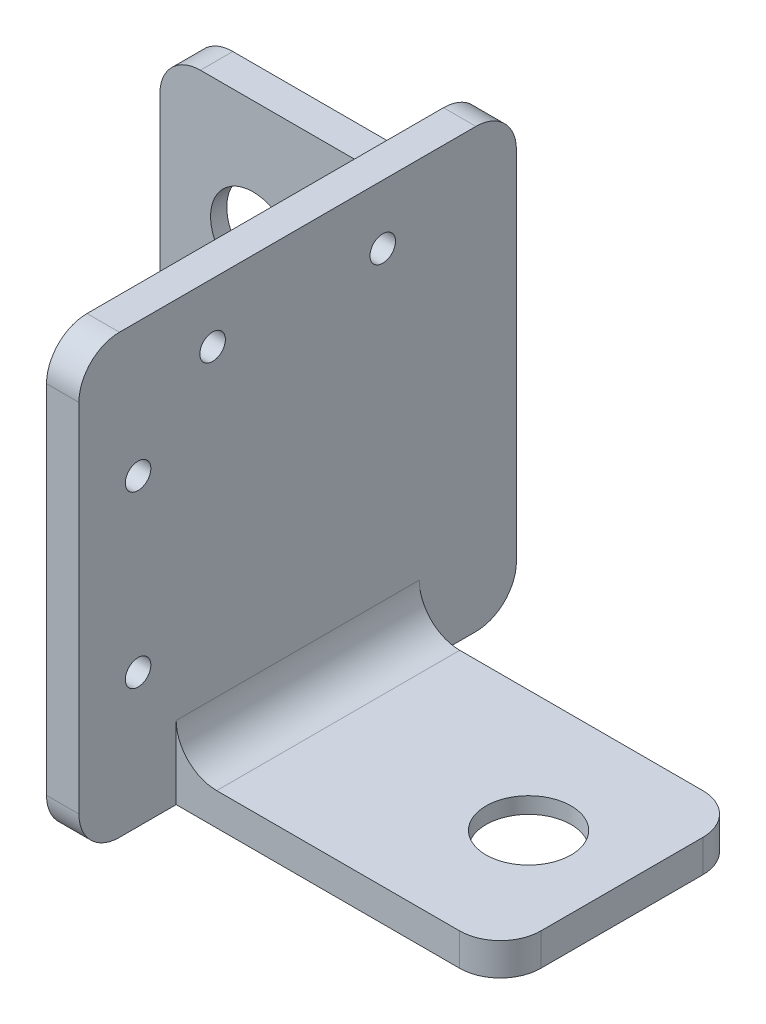
ISO-10303-21;
HEADER;
FILE_DESCRIPTION(('STEP AP214'),'2;1');
FILE_NAME('part.step','',(''),(''),'','','');
FILE_SCHEMA(('AUTOMOTIVE_DESIGN { 1 0 10303 214 1 1 1 1 }'));
ENDSEC;
DATA;
#1=APPLICATION_CONTEXT('core data for automotive mechanical design processes');
#2=APPLICATION_PROTOCOL_DEFINITION('international standard','automotive_design',2000,#1);
#3=PRODUCT_CONTEXT('',#1,'mechanical');
#4=PRODUCT('Part','Part','',(#3));
#5=PRODUCT_RELATED_PRODUCT_CATEGORY('part','',(#4));
#6=PRODUCT_DEFINITION_FORMATION('','',#4);
#7=PRODUCT_DEFINITION_CONTEXT('part definition',#1,'design');
#8=PRODUCT_DEFINITION('design','',#6,#7);
#9=PRODUCT_DEFINITION_SHAPE('','',#8);
#10=(LENGTH_UNIT() NAMED_UNIT(*) SI_UNIT(.MILLI.,.METRE.));
#11=(NAMED_UNIT(*) PLANE_ANGLE_UNIT() SI_UNIT($,.RADIAN.));
#12=(NAMED_UNIT(*) SI_UNIT($,.STERADIAN.) SOLID_ANGLE_UNIT());
#13=UNCERTAINTY_MEASURE_WITH_UNIT(LENGTH_MEASURE(1.E-05),#10,'distance_accuracy_value','');
#14=(GEOMETRIC_REPRESENTATION_CONTEXT(3) GLOBAL_UNCERTAINTY_ASSIGNED_CONTEXT((#13)) GLOBAL_UNIT_ASSIGNED_CONTEXT((#10,
#11,#12)) REPRESENTATION_CONTEXT('',''));
#15=CARTESIAN_POINT('',(0.,0.,0.));
#16=DIRECTION('',(0.,0.,1.));
#17=DIRECTION('',(1.,0.,0.));
#18=AXIS2_PLACEMENT_3D('',#15,#16,#17);
#19=CARTESIAN_POINT('',(0.,0.,0.));
#20=DIRECTION('',(-1.,0.,0.));
#21=DIRECTION('',(0.,0.,1.));
#22=AXIS2_PLACEMENT_3D('',#19,#20,#21);
#23=PLANE('',#22);
#24=CARTESIAN_POINT('',(0.,-10.5,19.7));
#25=DIRECTION('',(-1.,0.,0.));
#26=DIRECTION('',(0.,0.,1.));
#27=AXIS2_PLACEMENT_3D('',#24,#25,#26);
#28=CIRCLE('',#27,1.575);
#29=CARTESIAN_POINT('',(0.,-10.5,21.275));
#30=VERTEX_POINT('',#29);
#31=EDGE_CURVE('E460',#30,#30,#28,.T.);
#32=ORIENTED_EDGE('',*,*,#31,.F.);
#33=EDGE_LOOP('',(#32));
#34=FACE_BOUND('',#33,.T.);
#35=CARTESIAN_POINT('',(0.,10.5,19.7));
#36=DIRECTION('',(-1.,0.,0.));
#37=DIRECTION('',(0.,0.,1.));
#38=AXIS2_PLACEMENT_3D('',#35,#36,#37);
#39=CIRCLE('',#38,1.575);
#40=CARTESIAN_POINT('',(0.,10.5,21.275));
#41=VERTEX_POINT('',#40);
#42=EDGE_CURVE('E468',#41,#41,#39,.T.);
#43=ORIENTED_EDGE('',*,*,#42,.F.);
#44=EDGE_LOOP('',(#43));
#45=FACE_BOUND('',#44,.T.);
#46=CARTESIAN_POINT('',(0.,19.7,-10.5));
#47=DIRECTION('',(-1.,0.,0.));
#48=DIRECTION('',(0.,0.,1.));
#49=AXIS2_PLACEMENT_3D('',#46,#47,#48);
#50=CIRCLE('',#49,1.575);
#51=CARTESIAN_POINT('',(0.,19.7,-8.925));
#52=VERTEX_POINT('',#51);
#53=EDGE_CURVE('E293',#52,#52,#50,.T.);
#54=ORIENTED_EDGE('',*,*,#53,.F.);
#55=EDGE_LOOP('',(#54));
#56=FACE_BOUND('',#55,.T.);
#57=CARTESIAN_POINT('',(0.,19.7,10.5));
#58=DIRECTION('',(-1.,0.,0.));
#59=DIRECTION('',(0.,0.,1.));
#60=AXIS2_PLACEMENT_3D('',#57,#58,#59);
#61=CIRCLE('',#60,1.575);
#62=CARTESIAN_POINT('',(0.,19.7,12.075));
#63=VERTEX_POINT('',#62);
#64=EDGE_CURVE('E288',#63,#63,#61,.T.);
#65=ORIENTED_EDGE('',*,*,#64,.F.);
#66=EDGE_LOOP('',(#65));
#67=FACE_BOUND('',#66,.T.);
#68=DIRECTION('',(0.,1.,0.));
#69=VECTOR('',#68,1.);
#70=CARTESIAN_POINT('',(0.,15.003817371608,-23.));
#71=LINE('',#70,#69);
#72=CARTESIAN_POINT('',(0.,15.0036310727536,-23.));
#73=VERTEX_POINT('',#72);
#74=CARTESIAN_POINT('',(0.,15.003817371608,-23.));
#75=VERTEX_POINT('',#74);
#76=EDGE_CURVE('E484',#73,#75,#71,.T.);
#77=ORIENTED_EDGE('',*,*,#76,.F.);
#78=DIRECTION('',(0.,0.,1.));
#79=VECTOR('',#78,1.);
#80=CARTESIAN_POINT('',(0.,15.0036310727536,-23.));
#81=LINE('',#80,#79);
#82=CARTESIAN_POINT('',(0.,15.0036310727536,-17.0430910526527));
#83=VERTEX_POINT('',#82);
#84=EDGE_CURVE('E47',#73,#83,#81,.T.);
#85=ORIENTED_EDGE('',*,*,#84,.T.);
#86=DIRECTION('',(0.,-1.,0.));
#87=VECTOR('',#86,1.);
#88=CARTESIAN_POINT('',(0.,15.0036310727536,-17.0430910526527));
#89=LINE('',#88,#87);
#90=CARTESIAN_POINT('',(0.,-14.9963689272464,-17.0430910526526));
#91=VERTEX_POINT('',#90);
#92=EDGE_CURVE('E455',#83,#91,#89,.T.);
#93=ORIENTED_EDGE('',*,*,#92,.T.);
#94=DIRECTION('',(0.,0.,1.));
#95=VECTOR('',#94,1.);
#96=CARTESIAN_POINT('',(0.,-14.9963689272464,-27.));
#97=LINE('',#96,#95);
#98=CARTESIAN_POINT('',(0.,-14.9963689272464,-27.));
#99=VERTEX_POINT('',#98);
#100=EDGE_CURVE('E55',#99,#91,#97,.T.);
#101=ORIENTED_EDGE('',*,*,#100,.F.);
#102=DIRECTION('',(0.,1.,0.));
#103=VECTOR('',#102,1.);
#104=CARTESIAN_POINT('',(0.,-27.,-27.));
#105=LINE('',#104,#103);
#106=CARTESIAN_POINT('',(0.,-22.,-27.));
#107=VERTEX_POINT('',#106);
#108=EDGE_CURVE('E343',#107,#99,#105,.T.);
#109=ORIENTED_EDGE('',*,*,#108,.F.);
#110=CARTESIAN_POINT('',(0.,-22.,-22.));
#111=DIRECTION('',(-1.,0.,0.));
#112=DIRECTION('',(0.,0.,1.));
#113=AXIS2_PLACEMENT_3D('',#110,#111,#112);
#114=CIRCLE('',#113,5.);
#115=CARTESIAN_POINT('',(0.,-27.,-22.));
#116=VERTEX_POINT('',#115);
#117=EDGE_CURVE('E198',#107,#116,#114,.T.);
#118=ORIENTED_EDGE('',*,*,#117,.T.);
#119=DIRECTION('',(0.,0.,-1.));
#120=VECTOR('',#119,1.);
#121=CARTESIAN_POINT('',(0.,-27.,27.));
#122=LINE('',#121,#120);
#123=CARTESIAN_POINT('',(0.,-27.,22.));
#124=VERTEX_POINT('',#123);
#125=EDGE_CURVE('E206',#124,#116,#122,.T.);
#126=ORIENTED_EDGE('',*,*,#125,.F.);
#127=CARTESIAN_POINT('',(0.,-22.,22.));
#128=DIRECTION('',(-1.,0.,0.));
#129=DIRECTION('',(0.,0.,1.));
#130=AXIS2_PLACEMENT_3D('',#127,#128,#129);
#131=CIRCLE('',#130,5.);
#132=CARTESIAN_POINT('',(0.,-22.,27.));
#133=VERTEX_POINT('',#132);
#134=EDGE_CURVE('E188',#124,#133,#131,.T.);
#135=ORIENTED_EDGE('',*,*,#134,.T.);
#136=DIRECTION('',(0.,-1.,0.));
#137=VECTOR('',#136,1.);
#138=CARTESIAN_POINT('',(0.,-27.,27.));
#139=LINE('',#138,#137);
#140=CARTESIAN_POINT('',(0.,22.,27.));
#141=VERTEX_POINT('',#140);
#142=EDGE_CURVE('E215',#141,#133,#139,.T.);
#143=ORIENTED_EDGE('',*,*,#142,.F.);
#144=CARTESIAN_POINT('',(0.,22.,22.));
#145=DIRECTION('',(-1.,0.,0.));
#146=DIRECTION('',(0.,0.,1.));
#147=AXIS2_PLACEMENT_3D('',#144,#145,#146);
#148=CIRCLE('',#147,5.);
#149=CARTESIAN_POINT('',(0.,27.,22.));
#150=VERTEX_POINT('',#149);
#151=EDGE_CURVE('E210',#141,#150,#148,.T.);
#152=ORIENTED_EDGE('',*,*,#151,.T.);
#153=DIRECTION('',(0.,0.,1.));
#154=VECTOR('',#153,1.);
#155=CARTESIAN_POINT('',(0.,27.,27.));
#156=LINE('',#155,#154);
#157=CARTESIAN_POINT('',(0.,27.,-22.));
#158=VERTEX_POINT('',#157);
#159=EDGE_CURVE('E220',#158,#150,#156,.T.);
#160=ORIENTED_EDGE('',*,*,#159,.F.);
#161=CARTESIAN_POINT('',(0.,22.,-22.));
#162=DIRECTION('',(-1.,0.,0.));
#163=DIRECTION('',(0.,0.,1.));
#164=AXIS2_PLACEMENT_3D('',#161,#162,#163);
#165=CIRCLE('',#164,5.);
#166=CARTESIAN_POINT('',(0.,22.,-27.));
#167=VERTEX_POINT('',#166);
#168=EDGE_CURVE('E226',#158,#167,#165,.T.);
#169=ORIENTED_EDGE('',*,*,#168,.T.);
#170=CARTESIAN_POINT('',(0.,15.003817371608,-27.));
#171=VERTEX_POINT('',#170);
#172=EDGE_CURVE('E334',#171,#167,#105,.T.);
#173=ORIENTED_EDGE('',*,*,#172,.F.);
#174=DIRECTION('',(0.,0.,-1.));
#175=VECTOR('',#174,1.);
#176=CARTESIAN_POINT('',(0.,15.003817371608,-27.));
#177=LINE('',#176,#175);
#178=EDGE_CURVE('E486',#75,#171,#177,.T.);
#179=ORIENTED_EDGE('',*,*,#178,.F.);
#180=EDGE_LOOP('',(#77,#85,#93,#101,#109,#118,#126,#135,#143,#152,#160,#169,#173,#179));
#181=FACE_BOUND('',#180,.T.);
#182=ADVANCED_FACE('F32',(#34,#45,#56,#67,#181),#23,.T.);
#183=CARTESIAN_POINT('',(4.,0.,0.));
#184=DIRECTION('',(-1.,0.,0.));
#185=DIRECTION('',(0.,0.,1.));
#186=AXIS2_PLACEMENT_3D('',#183,#184,#185);
#187=PLANE('',#186);
#188=CARTESIAN_POINT('',(4.,-10.5,19.7));
#189=DIRECTION('',(-1.,0.,0.));
#190=DIRECTION('',(0.,0.,1.));
#191=AXIS2_PLACEMENT_3D('',#188,#189,#190);
#192=CIRCLE('',#191,1.575);
#193=CARTESIAN_POINT('',(4.,-10.5,21.275));
#194=VERTEX_POINT('',#193);
#195=EDGE_CURVE('E465',#194,#194,#192,.T.);
#196=ORIENTED_EDGE('',*,*,#195,.T.);
#197=EDGE_LOOP('',(#196));
#198=FACE_BOUND('',#197,.T.);
#199=CARTESIAN_POINT('',(4.,10.5,19.7));
#200=DIRECTION('',(-1.,0.,0.));
#201=DIRECTION('',(0.,0.,1.));
#202=AXIS2_PLACEMENT_3D('',#199,#200,#201);
#203=CIRCLE('',#202,1.575);
#204=CARTESIAN_POINT('',(4.,10.5,21.275));
#205=VERTEX_POINT('',#204);
#206=EDGE_CURVE('E471',#205,#205,#203,.T.);
#207=ORIENTED_EDGE('',*,*,#206,.T.);
#208=EDGE_LOOP('',(#207));
#209=FACE_BOUND('',#208,.T.);
#210=CARTESIAN_POINT('',(4.,19.7,-10.5));
#211=DIRECTION('',(1.,0.,0.));
#212=DIRECTION('',(0.,0.,-1.));
#213=AXIS2_PLACEMENT_3D('',#210,#211,#212);
#214=CIRCLE('',#213,1.575);
#215=CARTESIAN_POINT('',(4.,19.7,-12.075));
#216=VERTEX_POINT('',#215);
#217=EDGE_CURVE('E296',#216,#216,#214,.T.);
#218=ORIENTED_EDGE('',*,*,#217,.F.);
#219=EDGE_LOOP('',(#218));
#220=FACE_BOUND('',#219,.T.);
#221=CARTESIAN_POINT('',(4.,19.7,10.5));
#222=DIRECTION('',(1.,0.,0.));
#223=DIRECTION('',(0.,0.,-1.));
#224=AXIS2_PLACEMENT_3D('',#221,#222,#223);
#225=CIRCLE('',#224,1.575);
#226=CARTESIAN_POINT('',(4.,19.7,8.925));
#227=VERTEX_POINT('',#226);
#228=EDGE_CURVE('E292',#227,#227,#225,.T.);
#229=ORIENTED_EDGE('',*,*,#228,.F.);
#230=EDGE_LOOP('',(#229));
#231=FACE_BOUND('',#230,.T.);
#232=DIRECTION('',(0.,-1.,0.));
#233=VECTOR('',#232,1.);
#234=CARTESIAN_POINT('',(4.,-27.,14.9965263929302));
#235=LINE('',#234,#233);
#236=CARTESIAN_POINT('',(4.,-18.,14.9965263929302));
#237=VERTEX_POINT('',#236);
#238=CARTESIAN_POINT('',(4.,-27.,14.9965263929302));
#239=VERTEX_POINT('',#238);
#240=EDGE_CURVE('E308',#237,#239,#235,.T.);
#241=ORIENTED_EDGE('',*,*,#240,.F.);
#242=DIRECTION('',(0.,0.,1.));
#243=VECTOR('',#242,1.);
#244=CARTESIAN_POINT('',(4.,-18.,-15.0034736070698));
#245=LINE('',#244,#243);
#246=CARTESIAN_POINT('',(4.,-18.,-15.0034736070698));
#247=VERTEX_POINT('',#246);
#248=EDGE_CURVE('E299',#237,#247,#245,.F.);
#249=ORIENTED_EDGE('',*,*,#248,.T.);
#250=DIRECTION('',(0.,1.,0.));
#251=VECTOR('',#250,1.);
#252=CARTESIAN_POINT('',(4.,-27.,-15.0034736070698));
#253=LINE('',#252,#251);
#254=CARTESIAN_POINT('',(4.,-27.,-15.0034736070698));
#255=VERTEX_POINT('',#254);
#256=EDGE_CURVE('E317',#255,#247,#253,.T.);
#257=ORIENTED_EDGE('',*,*,#256,.F.);
#258=DIRECTION('',(0.,0.,-1.));
#259=VECTOR('',#258,1.);
#260=CARTESIAN_POINT('',(4.,-27.,27.));
#261=LINE('',#260,#259);
#262=CARTESIAN_POINT('',(4.,-27.,-22.));
#263=VERTEX_POINT('',#262);
#264=EDGE_CURVE('E341',#255,#263,#261,.T.);
#265=ORIENTED_EDGE('',*,*,#264,.T.);
#266=CARTESIAN_POINT('',(4.,-22.,-22.));
#267=DIRECTION('',(-1.,0.,0.));
#268=DIRECTION('',(0.,0.,1.));
#269=AXIS2_PLACEMENT_3D('',#266,#267,#268);
#270=CIRCLE('',#269,5.);
#271=CARTESIAN_POINT('',(4.,-22.,-27.));
#272=VERTEX_POINT('',#271);
#273=EDGE_CURVE('E237',#263,#272,#270,.F.);
#274=ORIENTED_EDGE('',*,*,#273,.T.);
#275=DIRECTION('',(0.,1.,0.));
#276=VECTOR('',#275,1.);
#277=CARTESIAN_POINT('',(4.,-27.,-27.));
#278=LINE('',#277,#276);
#279=CARTESIAN_POINT('',(4.,22.,-27.));
#280=VERTEX_POINT('',#279);
#281=EDGE_CURVE('E214',#272,#280,#278,.T.);
#282=ORIENTED_EDGE('',*,*,#281,.T.);
#283=CARTESIAN_POINT('',(4.,22.,-22.));
#284=DIRECTION('',(-1.,0.,0.));
#285=DIRECTION('',(0.,0.,1.));
#286=AXIS2_PLACEMENT_3D('',#283,#284,#285);
#287=CIRCLE('',#286,5.);
#288=CARTESIAN_POINT('',(4.,27.,-22.));
#289=VERTEX_POINT('',#288);
#290=EDGE_CURVE('E235',#280,#289,#287,.F.);
#291=ORIENTED_EDGE('',*,*,#290,.T.);
#292=DIRECTION('',(0.,0.,1.));
#293=VECTOR('',#292,1.);
#294=CARTESIAN_POINT('',(4.,27.,27.));
#295=LINE('',#294,#293);
#296=CARTESIAN_POINT('',(4.,27.,22.));
#297=VERTEX_POINT('',#296);
#298=EDGE_CURVE('E218',#289,#297,#295,.T.);
#299=ORIENTED_EDGE('',*,*,#298,.T.);
#300=CARTESIAN_POINT('',(4.,22.,22.));
#301=DIRECTION('',(-1.,0.,0.));
#302=DIRECTION('',(0.,0.,1.));
#303=AXIS2_PLACEMENT_3D('',#300,#301,#302);
#304=CIRCLE('',#303,5.);
#305=CARTESIAN_POINT('',(4.,22.,27.));
#306=VERTEX_POINT('',#305);
#307=EDGE_CURVE('E233',#297,#306,#304,.F.);
#308=ORIENTED_EDGE('',*,*,#307,.T.);
#309=DIRECTION('',(0.,-1.,0.));
#310=VECTOR('',#309,1.);
#311=CARTESIAN_POINT('',(4.,-27.,27.));
#312=LINE('',#311,#310);
#313=CARTESIAN_POINT('',(4.,-22.,27.));
#314=VERTEX_POINT('',#313);
#315=EDGE_CURVE('E338',#306,#314,#312,.T.);
#316=ORIENTED_EDGE('',*,*,#315,.T.);
#317=CARTESIAN_POINT('',(4.,-22.,22.));
#318=DIRECTION('',(-1.,0.,0.));
#319=DIRECTION('',(0.,0.,1.));
#320=AXIS2_PLACEMENT_3D('',#317,#318,#319);
#321=CIRCLE('',#320,5.);
#322=CARTESIAN_POINT('',(4.,-27.,22.));
#323=VERTEX_POINT('',#322);
#324=EDGE_CURVE('E239',#314,#323,#321,.F.);
#325=ORIENTED_EDGE('',*,*,#324,.T.);
#326=EDGE_CURVE('E209',#323,#239,#261,.T.);
#327=ORIENTED_EDGE('',*,*,#326,.T.);
#328=EDGE_LOOP('',(#241,#249,#257,#265,#274,#282,#291,#299,#308,#316,#325,#327));
#329=FACE_BOUND('',#328,.T.);
#330=ADVANCED_FACE('F316',(#198,#209,#220,#231,#329),#187,.F.);
#331=CARTESIAN_POINT('',(4.,-27.,-27.));
#332=DIRECTION('',(0.,0.,1.));
#333=DIRECTION('',(1.,0.,0.));
#334=AXIS2_PLACEMENT_3D('',#331,#332,#333);
#335=PLANE('',#334);
#336=CARTESIAN_POINT('',(-24.5,0.,-27.));
#337=DIRECTION('',(0.,0.,-1.));
#338=DIRECTION('',(-1.,0.,0.));
#339=AXIS2_PLACEMENT_3D('',#336,#337,#338);
#340=CIRCLE('',#339,11.);
#341=CARTESIAN_POINT('',(-35.5,0.,-27.));
#342=VERTEX_POINT('',#341);
#343=EDGE_CURVE('E601',#342,#342,#340,.T.);
#344=ORIENTED_EDGE('',*,*,#343,.F.);
#345=EDGE_LOOP('',(#344));
#346=FACE_BOUND('',#345,.T.);
#347=DIRECTION('',(0.,-1.,0.));
#348=VECTOR('',#347,1.);
#349=CARTESIAN_POINT('',(-36.,15.003817371608,-27.));
#350=LINE('',#349,#348);
#351=CARTESIAN_POINT('',(-36.,10.003817371608,-27.));
#352=VERTEX_POINT('',#351);
#353=CARTESIAN_POINT('',(-36.,-9.9963689272464,-27.));
#354=VERTEX_POINT('',#353);
#355=EDGE_CURVE('E291',#352,#354,#350,.T.);
#356=ORIENTED_EDGE('',*,*,#355,.F.);
#357=CARTESIAN_POINT('',(-31.,10.003817371608,-27.));
#358=DIRECTION('',(0.,0.,1.));
#359=DIRECTION('',(1.,0.,0.));
#360=AXIS2_PLACEMENT_3D('',#357,#358,#359);
#361=CIRCLE('',#360,5.);
#362=CARTESIAN_POINT('',(-31.,15.003817371608,-27.));
#363=VERTEX_POINT('',#362);
#364=EDGE_CURVE('E277',#352,#363,#361,.F.);
#365=ORIENTED_EDGE('',*,*,#364,.T.);
#366=DIRECTION('',(1.,0.,0.));
#367=VECTOR('',#366,1.);
#368=CARTESIAN_POINT('',(-3.,15.003817371608,-27.));
#369=LINE('',#368,#367);
#370=EDGE_CURVE('E489',#363,#171,#369,.T.);
#371=ORIENTED_EDGE('',*,*,#370,.T.);
#372=ORIENTED_EDGE('',*,*,#172,.T.);
#373=DIRECTION('',(-1.,0.,0.));
#374=VECTOR('',#373,1.);
#375=CARTESIAN_POINT('',(4.,22.,-27.));
#376=LINE('',#375,#374);
#377=EDGE_CURVE('E241',#167,#280,#376,.F.);
#378=ORIENTED_EDGE('',*,*,#377,.T.);
#379=ORIENTED_EDGE('',*,*,#281,.F.);
#380=DIRECTION('',(-1.,0.,0.));
#381=VECTOR('',#380,1.);
#382=CARTESIAN_POINT('',(4.,-22.,-27.));
#383=LINE('',#382,#381);
#384=EDGE_CURVE('E243',#272,#107,#383,.T.);
#385=ORIENTED_EDGE('',*,*,#384,.T.);
#386=ORIENTED_EDGE('',*,*,#108,.T.);
#387=DIRECTION('',(1.,0.,0.));
#388=VECTOR('',#387,1.);
#389=CARTESIAN_POINT('',(-3.,-14.9963689272464,-27.));
#390=LINE('',#389,#388);
#391=CARTESIAN_POINT('',(-31.,-14.9963689272464,-27.));
#392=VERTEX_POINT('',#391);
#393=EDGE_CURVE('E496',#392,#99,#390,.T.);
#394=ORIENTED_EDGE('',*,*,#393,.F.);
#395=CARTESIAN_POINT('',(-31.,-9.9963689272464,-27.));
#396=DIRECTION('',(0.,0.,1.));
#397=DIRECTION('',(1.,0.,0.));
#398=AXIS2_PLACEMENT_3D('',#395,#396,#397);
#399=CIRCLE('',#398,5.);
#400=EDGE_CURVE('E275',#392,#354,#399,.F.);
#401=ORIENTED_EDGE('',*,*,#400,.T.);
#402=EDGE_LOOP('',(#356,#365,#371,#372,#378,#379,#385,#386,#394,#401));
#403=FACE_BOUND('',#402,.T.);
#404=ADVANCED_FACE('F367',(#346,#403),#335,.F.);
#405=CARTESIAN_POINT('',(4.,27.,27.));
#406=DIRECTION('',(0.,-1.,0.));
#407=DIRECTION('',(0.,0.,-1.));
#408=AXIS2_PLACEMENT_3D('',#405,#406,#407);
#409=PLANE('',#408);
#410=ORIENTED_EDGE('',*,*,#298,.F.);
#411=DIRECTION('',(-1.,0.,0.));
#412=VECTOR('',#411,1.);
#413=CARTESIAN_POINT('',(4.,27.,-22.));
#414=LINE('',#413,#412);
#415=EDGE_CURVE('E248',#289,#158,#414,.T.);
#416=ORIENTED_EDGE('',*,*,#415,.T.);
#417=ORIENTED_EDGE('',*,*,#159,.T.);
#418=DIRECTION('',(-1.,0.,0.));
#419=VECTOR('',#418,1.);
#420=CARTESIAN_POINT('',(4.,27.,22.));
#421=LINE('',#420,#419);
#422=EDGE_CURVE('E246',#150,#297,#421,.F.);
#423=ORIENTED_EDGE('',*,*,#422,.T.);
#424=EDGE_LOOP('',(#410,#416,#417,#423));
#425=FACE_BOUND('',#424,.T.);
#426=ADVANCED_FACE('F350',(#425),#409,.F.);
#427=CARTESIAN_POINT('',(4.,-27.,27.));
#428=DIRECTION('',(0.,0.,-1.));
#429=DIRECTION('',(-1.,0.,0.));
#430=AXIS2_PLACEMENT_3D('',#427,#428,#429);
#431=PLANE('',#430);
#432=ORIENTED_EDGE('',*,*,#142,.T.);
#433=DIRECTION('',(-1.,0.,0.));
#434=VECTOR('',#433,1.);
#435=CARTESIAN_POINT('',(4.,-22.,27.));
#436=LINE('',#435,#434);
#437=EDGE_CURVE('E193',#133,#314,#436,.F.);
#438=ORIENTED_EDGE('',*,*,#437,.T.);
#439=ORIENTED_EDGE('',*,*,#315,.F.);
#440=DIRECTION('',(-1.,0.,0.));
#441=VECTOR('',#440,1.);
#442=CARTESIAN_POINT('',(4.,22.,27.));
#443=LINE('',#442,#441);
#444=EDGE_CURVE('E197',#306,#141,#443,.T.);
#445=ORIENTED_EDGE('',*,*,#444,.T.);
#446=EDGE_LOOP('',(#432,#438,#439,#445));
#447=FACE_BOUND('',#446,.T.);
#448=ADVANCED_FACE('F358',(#447),#431,.F.);
#449=CARTESIAN_POINT('',(4.,-27.,27.));
#450=DIRECTION('',(0.,1.,0.));
#451=DIRECTION('',(0.,0.,1.));
#452=AXIS2_PLACEMENT_3D('',#449,#450,#451);
#453=PLANE('',#452);
#454=CARTESIAN_POINT('',(32.5,-27.,0.));
#455=DIRECTION('',(0.,-1.,0.));
#456=DIRECTION('',(0.,0.,-1.));
#457=AXIS2_PLACEMENT_3D('',#454,#455,#456);
#458=CIRCLE('',#457,11.);
#459=CARTESIAN_POINT('',(32.5,-27.,-11.));
#460=VERTEX_POINT('',#459);
#461=EDGE_CURVE('E443',#460,#460,#458,.T.);
#462=ORIENTED_EDGE('',*,*,#461,.F.);
#463=EDGE_LOOP('',(#462));
#464=FACE_BOUND('',#463,.T.);
#465=DIRECTION('',(-1.,0.,0.));
#466=VECTOR('',#465,1.);
#467=CARTESIAN_POINT('',(7.,-27.,-15.0034736070698));
#468=LINE('',#467,#466);
#469=CARTESIAN_POINT('',(39.,-27.,-15.0034736070698));
#470=VERTEX_POINT('',#469);
#471=EDGE_CURVE('E331',#470,#255,#468,.T.);
#472=ORIENTED_EDGE('',*,*,#471,.F.);
#473=CARTESIAN_POINT('',(39.,-27.,-10.0034736070698));
#474=DIRECTION('',(0.,1.,0.));
#475=DIRECTION('',(0.,0.,1.));
#476=AXIS2_PLACEMENT_3D('',#473,#474,#475);
#477=CIRCLE('',#476,5.);
#478=CARTESIAN_POINT('',(44.,-27.,-10.0034736070698));
#479=VERTEX_POINT('',#478);
#480=EDGE_CURVE('E265',#470,#479,#477,.F.);
#481=ORIENTED_EDGE('',*,*,#480,.T.);
#482=DIRECTION('',(0.,0.,-1.));
#483=VECTOR('',#482,1.);
#484=CARTESIAN_POINT('',(44.,-27.,14.9965263929302));
#485=LINE('',#484,#483);
#486=CARTESIAN_POINT('',(44.,-27.,9.99652639293024));
#487=VERTEX_POINT('',#486);
#488=EDGE_CURVE('E323',#487,#479,#485,.T.);
#489=ORIENTED_EDGE('',*,*,#488,.F.);
#490=CARTESIAN_POINT('',(39.,-27.,9.99652639293024));
#491=DIRECTION('',(0.,1.,0.));
#492=DIRECTION('',(0.,0.,1.));
#493=AXIS2_PLACEMENT_3D('',#490,#491,#492);
#494=CIRCLE('',#493,5.);
#495=CARTESIAN_POINT('',(39.,-27.,14.9965263929302));
#496=VERTEX_POINT('',#495);
#497=EDGE_CURVE('E263',#487,#496,#494,.F.);
#498=ORIENTED_EDGE('',*,*,#497,.T.);
#499=DIRECTION('',(-1.,0.,0.));
#500=VECTOR('',#499,1.);
#501=CARTESIAN_POINT('',(7.,-27.,14.9965263929302));
#502=LINE('',#501,#500);
#503=EDGE_CURVE('E333',#496,#239,#502,.T.);
#504=ORIENTED_EDGE('',*,*,#503,.T.);
#505=ORIENTED_EDGE('',*,*,#326,.F.);
#506=DIRECTION('',(-1.,0.,0.));
#507=VECTOR('',#506,1.);
#508=CARTESIAN_POINT('',(4.,-27.,22.));
#509=LINE('',#508,#507);
#510=EDGE_CURVE('E192',#323,#124,#509,.T.);
#511=ORIENTED_EDGE('',*,*,#510,.T.);
#512=ORIENTED_EDGE('',*,*,#125,.T.);
#513=DIRECTION('',(-1.,0.,0.));
#514=VECTOR('',#513,1.);
#515=CARTESIAN_POINT('',(4.,-27.,-22.));
#516=LINE('',#515,#514);
#517=EDGE_CURVE('E211',#116,#263,#516,.F.);
#518=ORIENTED_EDGE('',*,*,#517,.T.);
#519=ORIENTED_EDGE('',*,*,#264,.F.);
#520=EDGE_LOOP('',(#472,#481,#489,#498,#504,#505,#511,#512,#518,#519));
#521=FACE_BOUND('',#520,.T.);
#522=ADVANCED_FACE('F204',(#464,#521),#453,.F.);
#523=CARTESIAN_POINT('',(4.,-22.,22.));
#524=DIRECTION('',(-1.,0.,0.));
#525=DIRECTION('',(0.,0.,1.));
#526=AXIS2_PLACEMENT_3D('',#523,#524,#525);
#527=CYLINDRICAL_SURFACE('',#526,5.);
#528=ORIENTED_EDGE('',*,*,#324,.F.);
#529=ORIENTED_EDGE('',*,*,#437,.F.);
#530=ORIENTED_EDGE('',*,*,#134,.F.);
#531=ORIENTED_EDGE('',*,*,#510,.F.);
#532=EDGE_LOOP('',(#528,#529,#530,#531));
#533=FACE_BOUND('',#532,.T.);
#534=ADVANCED_FACE('F191',(#533),#527,.T.);
#535=CARTESIAN_POINT('',(4.,-22.,-22.));
#536=DIRECTION('',(-1.,0.,0.));
#537=DIRECTION('',(0.,0.,1.));
#538=AXIS2_PLACEMENT_3D('',#535,#536,#537);
#539=CYLINDRICAL_SURFACE('',#538,5.);
#540=ORIENTED_EDGE('',*,*,#273,.F.);
#541=ORIENTED_EDGE('',*,*,#517,.F.);
#542=ORIENTED_EDGE('',*,*,#117,.F.);
#543=ORIENTED_EDGE('',*,*,#384,.F.);
#544=EDGE_LOOP('',(#540,#541,#542,#543));
#545=FACE_BOUND('',#544,.T.);
#546=ADVANCED_FACE('F515',(#545),#539,.T.);
#547=CARTESIAN_POINT('',(4.,22.,-22.));
#548=DIRECTION('',(-1.,0.,0.));
#549=DIRECTION('',(0.,0.,1.));
#550=AXIS2_PLACEMENT_3D('',#547,#548,#549);
#551=CYLINDRICAL_SURFACE('',#550,5.);
#552=ORIENTED_EDGE('',*,*,#290,.F.);
#553=ORIENTED_EDGE('',*,*,#377,.F.);
#554=ORIENTED_EDGE('',*,*,#168,.F.);
#555=ORIENTED_EDGE('',*,*,#415,.F.);
#556=EDGE_LOOP('',(#552,#553,#554,#555));
#557=FACE_BOUND('',#556,.T.);
#558=ADVANCED_FACE('F517',(#557),#551,.T.);
#559=CARTESIAN_POINT('',(4.,22.,22.));
#560=DIRECTION('',(-1.,0.,0.));
#561=DIRECTION('',(0.,0.,1.));
#562=AXIS2_PLACEMENT_3D('',#559,#560,#561);
#563=CYLINDRICAL_SURFACE('',#562,5.);
#564=ORIENTED_EDGE('',*,*,#307,.F.);
#565=ORIENTED_EDGE('',*,*,#422,.F.);
#566=ORIENTED_EDGE('',*,*,#151,.F.);
#567=ORIENTED_EDGE('',*,*,#444,.F.);
#568=EDGE_LOOP('',(#564,#565,#566,#567));
#569=FACE_BOUND('',#568,.T.);
#570=ADVANCED_FACE('F354',(#569),#563,.T.);
#571=CARTESIAN_POINT('',(7.,-27.,14.9965263929302));
#572=DIRECTION('',(0.,0.,-1.));
#573=DIRECTION('',(-1.,0.,0.));
#574=AXIS2_PLACEMENT_3D('',#571,#572,#573);
#575=PLANE('',#574);
#576=ORIENTED_EDGE('',*,*,#503,.F.);
#577=DIRECTION('',(0.,-1.,0.));
#578=VECTOR('',#577,1.);
#579=CARTESIAN_POINT('',(39.,-27.,14.9965263929302));
#580=LINE('',#579,#578);
#581=CARTESIAN_POINT('',(39.,-23.,14.9965263929302));
#582=VERTEX_POINT('',#581);
#583=EDGE_CURVE('E267',#496,#582,#580,.F.);
#584=ORIENTED_EDGE('',*,*,#583,.T.);
#585=DIRECTION('',(-1.,0.,0.));
#586=VECTOR('',#585,1.);
#587=CARTESIAN_POINT('',(7.,-23.,14.9965263929302));
#588=LINE('',#587,#586);
#589=CARTESIAN_POINT('',(9.,-23.,14.9965263929302));
#590=VERTEX_POINT('',#589);
#591=EDGE_CURVE('E310',#582,#590,#588,.T.);
#592=ORIENTED_EDGE('',*,*,#591,.T.);
#593=CARTESIAN_POINT('',(9.,-18.,14.9965263929302));
#594=DIRECTION('',(0.,0.,-1.));
#595=DIRECTION('',(-1.,0.,0.));
#596=AXIS2_PLACEMENT_3D('',#593,#594,#595);
#597=CIRCLE('',#596,5.);
#598=EDGE_CURVE('E40',#590,#237,#597,.T.);
#599=ORIENTED_EDGE('',*,*,#598,.T.);
#600=ORIENTED_EDGE('',*,*,#240,.T.);
#601=EDGE_LOOP('',(#576,#584,#592,#599,#600));
#602=FACE_BOUND('',#601,.T.);
#603=ADVANCED_FACE('F307',(#602),#575,.F.);
#604=CARTESIAN_POINT('',(7.,-27.,-15.0034736070698));
#605=DIRECTION('',(0.,0.,1.));
#606=DIRECTION('',(1.,0.,0.));
#607=AXIS2_PLACEMENT_3D('',#604,#605,#606);
#608=PLANE('',#607);
#609=DIRECTION('',(-1.,0.,0.));
#610=VECTOR('',#609,1.);
#611=CARTESIAN_POINT('',(7.,-23.,-15.0034736070698));
#612=LINE('',#611,#610);
#613=CARTESIAN_POINT('',(39.,-23.,-15.0034736070698));
#614=VERTEX_POINT('',#613);
#615=CARTESIAN_POINT('',(9.,-23.,-15.0034736070698));
#616=VERTEX_POINT('',#615);
#617=EDGE_CURVE('E328',#614,#616,#612,.T.);
#618=ORIENTED_EDGE('',*,*,#617,.F.);
#619=DIRECTION('',(0.,1.,0.));
#620=VECTOR('',#619,1.);
#621=CARTESIAN_POINT('',(39.,-27.,-15.0034736070698));
#622=LINE('',#621,#620);
#623=EDGE_CURVE('E261',#614,#470,#622,.F.);
#624=ORIENTED_EDGE('',*,*,#623,.T.);
#625=ORIENTED_EDGE('',*,*,#471,.T.);
#626=ORIENTED_EDGE('',*,*,#256,.T.);
#627=CARTESIAN_POINT('',(9.,-18.,-15.0034736070698));
#628=DIRECTION('',(0.,0.,1.));
#629=DIRECTION('',(1.,0.,0.));
#630=AXIS2_PLACEMENT_3D('',#627,#628,#629);
#631=CIRCLE('',#630,5.);
#632=EDGE_CURVE('E11',#247,#616,#631,.T.);
#633=ORIENTED_EDGE('',*,*,#632,.T.);
#634=EDGE_LOOP('',(#618,#624,#625,#626,#633));
#635=FACE_BOUND('',#634,.T.);
#636=ADVANCED_FACE('F382',(#635),#608,.F.);
#637=CARTESIAN_POINT('',(7.,-23.,14.9965263929302));
#638=DIRECTION('',(0.,-1.,0.));
#639=DIRECTION('',(0.,0.,-1.));
#640=AXIS2_PLACEMENT_3D('',#637,#638,#639);
#641=PLANE('',#640);
#642=CARTESIAN_POINT('',(32.5,-23.,0.));
#643=DIRECTION('',(0.,1.,0.));
#644=DIRECTION('',(0.,0.,1.));
#645=AXIS2_PLACEMENT_3D('',#642,#643,#644);
#646=CIRCLE('',#645,5.25);
#647=CARTESIAN_POINT('',(32.5,-23.,5.25));
#648=VERTEX_POINT('',#647);
#649=EDGE_CURVE('E607',#648,#648,#646,.T.);
#650=ORIENTED_EDGE('',*,*,#649,.F.);
#651=EDGE_LOOP('',(#650));
#652=FACE_BOUND('',#651,.T.);
#653=ORIENTED_EDGE('',*,*,#617,.T.);
#654=DIRECTION('',(0.,0.,1.));
#655=VECTOR('',#654,1.);
#656=CARTESIAN_POINT('',(9.,-23.,14.9965263929302));
#657=LINE('',#656,#655);
#658=EDGE_CURVE('E287',#616,#590,#657,.T.);
#659=ORIENTED_EDGE('',*,*,#658,.T.);
#660=ORIENTED_EDGE('',*,*,#591,.F.);
#661=CARTESIAN_POINT('',(39.,-23.,9.99652639293024));
#662=DIRECTION('',(0.,-1.,0.));
#663=DIRECTION('',(0.,0.,-1.));
#664=AXIS2_PLACEMENT_3D('',#661,#662,#663);
#665=CIRCLE('',#664,5.);
#666=CARTESIAN_POINT('',(44.,-23.,9.99652639293024));
#667=VERTEX_POINT('',#666);
#668=EDGE_CURVE('E257',#582,#667,#665,.F.);
#669=ORIENTED_EDGE('',*,*,#668,.T.);
#670=DIRECTION('',(0.,0.,1.));
#671=VECTOR('',#670,1.);
#672=CARTESIAN_POINT('',(44.,-23.,14.9965263929302));
#673=LINE('',#672,#671);
#674=CARTESIAN_POINT('',(44.,-23.,-10.0034736070698));
#675=VERTEX_POINT('',#674);
#676=EDGE_CURVE('E319',#675,#667,#673,.T.);
#677=ORIENTED_EDGE('',*,*,#676,.F.);
#678=CARTESIAN_POINT('',(39.,-23.,-10.0034736070698));
#679=DIRECTION('',(0.,-1.,0.));
#680=DIRECTION('',(0.,0.,-1.));
#681=AXIS2_PLACEMENT_3D('',#678,#679,#680);
#682=CIRCLE('',#681,5.);
#683=EDGE_CURVE('E259',#675,#614,#682,.F.);
#684=ORIENTED_EDGE('',*,*,#683,.T.);
#685=EDGE_LOOP('',(#653,#659,#660,#669,#677,#684));
#686=FACE_BOUND('',#685,.T.);
#687=ADVANCED_FACE('F385',(#652,#686),#641,.F.);
#688=CARTESIAN_POINT('',(44.,0.,0.));
#689=DIRECTION('',(-1.,0.,0.));
#690=DIRECTION('',(0.,0.,1.));
#691=AXIS2_PLACEMENT_3D('',#688,#689,#690);
#692=PLANE('',#691);
#693=ORIENTED_EDGE('',*,*,#488,.T.);
#694=DIRECTION('',(0.,1.,0.));
#695=VECTOR('',#694,1.);
#696=CARTESIAN_POINT('',(44.,0.,-10.0034736070698));
#697=LINE('',#696,#695);
#698=EDGE_CURVE('E254',#479,#675,#697,.T.);
#699=ORIENTED_EDGE('',*,*,#698,.T.);
#700=ORIENTED_EDGE('',*,*,#676,.T.);
#701=DIRECTION('',(0.,-1.,0.));
#702=VECTOR('',#701,1.);
#703=CARTESIAN_POINT('',(44.,0.,9.99652639293024));
#704=LINE('',#703,#702);
#705=EDGE_CURVE('E251',#667,#487,#704,.T.);
#706=ORIENTED_EDGE('',*,*,#705,.T.);
#707=EDGE_LOOP('',(#693,#699,#700,#706));
#708=FACE_BOUND('',#707,.T.);
#709=ADVANCED_FACE('F389',(#708),#692,.F.);
#710=CARTESIAN_POINT('',(-3.,-14.9963689272464,-27.));
#711=DIRECTION('',(0.,1.,0.));
#712=DIRECTION('',(0.,0.,1.));
#713=AXIS2_PLACEMENT_3D('',#710,#711,#712);
#714=PLANE('',#713);
#715=DIRECTION('',(1.,0.,0.));
#716=VECTOR('',#715,1.);
#717=CARTESIAN_POINT('',(-3.,-14.9963689272464,-23.));
#718=LINE('',#717,#716);
#719=CARTESIAN_POINT('',(-31.,-14.9963689272464,-23.));
#720=VERTEX_POINT('',#719);
#721=CARTESIAN_POINT('',(-6.77177305791649,-14.9963689272464,-23.));
#722=VERTEX_POINT('',#721);
#723=EDGE_CURVE('E494',#720,#722,#718,.T.);
#724=ORIENTED_EDGE('',*,*,#723,.F.);
#725=DIRECTION('',(0.,0.,1.));
#726=VECTOR('',#725,1.);
#727=CARTESIAN_POINT('',(-31.,-14.9963689272464,-27.));
#728=LINE('',#727,#726);
#729=EDGE_CURVE('E285',#720,#392,#728,.F.);
#730=ORIENTED_EDGE('',*,*,#729,.T.);
#731=ORIENTED_EDGE('',*,*,#393,.T.);
#732=ORIENTED_EDGE('',*,*,#100,.T.);
#733=CARTESIAN_POINT('',(0.,-14.9963689272464,-17.0430910526526));
#734=CARTESIAN_POINT('',(-0.522042102032023,-14.9963689272464,-20.0037389349819));
#735=CARTESIAN_POINT('',(-3.43234437863522,-14.9963689272464,-22.4111686236911));
#736=CARTESIAN_POINT('',(-6.77177305791649,-14.9963689272464,-23.));
#737=B_SPLINE_CURVE_WITH_KNOTS('',3,(#733,#734,#735,#736),.UNSPECIFIED.,.F.,.F.,(4,4),(0.,1.),.UNSPECIFIED.);
#738=EDGE_CURVE('E442',#91,#722,#737,.T.);
#739=ORIENTED_EDGE('',*,*,#738,.T.);
#740=EDGE_LOOP('',(#724,#730,#731,#732,#739));
#741=FACE_BOUND('',#740,.T.);
#742=ADVANCED_FACE('F393',(#741),#714,.F.);
#743=CARTESIAN_POINT('',(-3.,15.003817371608,-23.));
#744=DIRECTION('',(0.,0.,-1.));
#745=DIRECTION('',(0.,1.,0.));
#746=AXIS2_PLACEMENT_3D('',#743,#744,#745);
#747=PLANE('',#746);
#748=CARTESIAN_POINT('',(-24.5,0.,-23.));
#749=DIRECTION('',(0.,0.,1.));
#750=DIRECTION('',(1.,0.,0.));
#751=AXIS2_PLACEMENT_3D('',#748,#749,#750);
#752=CIRCLE('',#751,5.25);
#753=CARTESIAN_POINT('',(-19.25,0.,-23.));
#754=VERTEX_POINT('',#753);
#755=EDGE_CURVE('E599',#754,#754,#752,.T.);
#756=ORIENTED_EDGE('',*,*,#755,.F.);
#757=EDGE_LOOP('',(#756));
#758=FACE_BOUND('',#757,.T.);
#759=ORIENTED_EDGE('',*,*,#723,.T.);
#760=DIRECTION('',(0.,-1.,0.));
#761=VECTOR('',#760,1.);
#762=CARTESIAN_POINT('',(-6.77177305791649,15.0036310727536,-23.));
#763=LINE('',#762,#761);
#764=CARTESIAN_POINT('',(-6.77177305791649,15.0036310727536,-23.));
#765=VERTEX_POINT('',#764);
#766=EDGE_CURVE('E450',#765,#722,#763,.T.);
#767=ORIENTED_EDGE('',*,*,#766,.F.);
#768=DIRECTION('',(1.,0.,0.));
#769=VECTOR('',#768,1.);
#770=CARTESIAN_POINT('',(-6.77177305791649,15.0036310727536,-23.));
#771=LINE('',#770,#769);
#772=EDGE_CURVE('E441',#765,#73,#771,.T.);
#773=ORIENTED_EDGE('',*,*,#772,.T.);
#774=ORIENTED_EDGE('',*,*,#76,.T.);
#775=DIRECTION('',(1.,0.,0.));
#776=VECTOR('',#775,1.);
#777=CARTESIAN_POINT('',(-3.,15.003817371608,-23.));
#778=LINE('',#777,#776);
#779=CARTESIAN_POINT('',(-31.,15.003817371608,-23.));
#780=VERTEX_POINT('',#779);
#781=EDGE_CURVE('E491',#780,#75,#778,.T.);
#782=ORIENTED_EDGE('',*,*,#781,.F.);
#783=CARTESIAN_POINT('',(-31.,10.003817371608,-23.));
#784=DIRECTION('',(0.,0.,-1.));
#785=DIRECTION('',(0.,1.,0.));
#786=AXIS2_PLACEMENT_3D('',#783,#784,#785);
#787=CIRCLE('',#786,5.);
#788=CARTESIAN_POINT('',(-36.,10.003817371608,-23.));
#789=VERTEX_POINT('',#788);
#790=EDGE_CURVE('E283',#780,#789,#787,.F.);
#791=ORIENTED_EDGE('',*,*,#790,.T.);
#792=DIRECTION('',(0.,1.,0.));
#793=VECTOR('',#792,1.);
#794=CARTESIAN_POINT('',(-36.,15.003817371608,-23.));
#795=LINE('',#794,#793);
#796=CARTESIAN_POINT('',(-36.,-9.9963689272464,-23.));
#797=VERTEX_POINT('',#796);
#798=EDGE_CURVE('E480',#797,#789,#795,.T.);
#799=ORIENTED_EDGE('',*,*,#798,.F.);
#800=CARTESIAN_POINT('',(-31.,-9.99636892724639,-23.));
#801=DIRECTION('',(0.,0.,-1.));
#802=DIRECTION('',(0.,1.,0.));
#803=AXIS2_PLACEMENT_3D('',#800,#801,#802);
#804=CIRCLE('',#803,5.);
#805=EDGE_CURVE('E281',#797,#720,#804,.F.);
#806=ORIENTED_EDGE('',*,*,#805,.T.);
#807=EDGE_LOOP('',(#759,#767,#773,#774,#782,#791,#799,#806));
#808=FACE_BOUND('',#807,.T.);
#809=ADVANCED_FACE('F397',(#758,#808),#747,.F.);
#810=CARTESIAN_POINT('',(-3.,15.003817371608,-27.));
#811=DIRECTION('',(0.,-1.,0.));
#812=DIRECTION('',(0.,0.,-1.));
#813=AXIS2_PLACEMENT_3D('',#810,#811,#812);
#814=PLANE('',#813);
#815=ORIENTED_EDGE('',*,*,#370,.F.);
#816=DIRECTION('',(0.,0.,-1.));
#817=VECTOR('',#816,1.);
#818=CARTESIAN_POINT('',(-31.,15.003817371608,-23.));
#819=LINE('',#818,#817);
#820=EDGE_CURVE('E279',#363,#780,#819,.F.);
#821=ORIENTED_EDGE('',*,*,#820,.T.);
#822=ORIENTED_EDGE('',*,*,#781,.T.);
#823=ORIENTED_EDGE('',*,*,#178,.T.);
#824=EDGE_LOOP('',(#815,#821,#822,#823));
#825=FACE_BOUND('',#824,.T.);
#826=ADVANCED_FACE('F400',(#825),#814,.F.);
#827=CARTESIAN_POINT('',(-36.,0.,0.));
#828=DIRECTION('',(-1.,0.,0.));
#829=DIRECTION('',(0.,0.,1.));
#830=AXIS2_PLACEMENT_3D('',#827,#828,#829);
#831=PLANE('',#830);
#832=ORIENTED_EDGE('',*,*,#798,.T.);
#833=DIRECTION('',(0.,0.,-1.));
#834=VECTOR('',#833,1.);
#835=CARTESIAN_POINT('',(-36.,10.003817371608,-27.));
#836=LINE('',#835,#834);
#837=EDGE_CURVE('E272',#789,#352,#836,.T.);
#838=ORIENTED_EDGE('',*,*,#837,.T.);
#839=ORIENTED_EDGE('',*,*,#355,.T.);
#840=DIRECTION('',(0.,0.,1.));
#841=VECTOR('',#840,1.);
#842=CARTESIAN_POINT('',(-36.,-9.99636892724639,-23.));
#843=LINE('',#842,#841);
#844=EDGE_CURVE('E269',#354,#797,#843,.T.);
#845=ORIENTED_EDGE('',*,*,#844,.T.);
#846=EDGE_LOOP('',(#832,#838,#839,#845));
#847=FACE_BOUND('',#846,.T.);
#848=ADVANCED_FACE('F404',(#847),#831,.T.);
#849=CARTESIAN_POINT('',(39.,0.,-10.0034736070698));
#850=DIRECTION('',(0.,1.,0.));
#851=DIRECTION('',(0.,0.,1.));
#852=AXIS2_PLACEMENT_3D('',#849,#850,#851);
#853=CYLINDRICAL_SURFACE('',#852,5.);
#854=ORIENTED_EDGE('',*,*,#480,.F.);
#855=ORIENTED_EDGE('',*,*,#623,.F.);
#856=ORIENTED_EDGE('',*,*,#683,.F.);
#857=ORIENTED_EDGE('',*,*,#698,.F.);
#858=EDGE_LOOP('',(#854,#855,#856,#857));
#859=FACE_BOUND('',#858,.T.);
#860=ADVANCED_FACE('F408',(#859),#853,.T.);
#861=CARTESIAN_POINT('',(39.,0.,9.99652639293024));
#862=DIRECTION('',(0.,-1.,0.));
#863=DIRECTION('',(0.,0.,-1.));
#864=AXIS2_PLACEMENT_3D('',#861,#862,#863);
#865=CYLINDRICAL_SURFACE('',#864,5.);
#866=ORIENTED_EDGE('',*,*,#668,.F.);
#867=ORIENTED_EDGE('',*,*,#583,.F.);
#868=ORIENTED_EDGE('',*,*,#497,.F.);
#869=ORIENTED_EDGE('',*,*,#705,.F.);
#870=EDGE_LOOP('',(#866,#867,#868,#869));
#871=FACE_BOUND('',#870,.T.);
#872=ADVANCED_FACE('F532',(#871),#865,.T.);
#873=CARTESIAN_POINT('',(-31.,10.003817371608,0.));
#874=DIRECTION('',(0.,0.,1.));
#875=DIRECTION('',(1.,0.,0.));
#876=AXIS2_PLACEMENT_3D('',#873,#874,#875);
#877=CYLINDRICAL_SURFACE('',#876,5.);
#878=ORIENTED_EDGE('',*,*,#790,.F.);
#879=ORIENTED_EDGE('',*,*,#820,.F.);
#880=ORIENTED_EDGE('',*,*,#364,.F.);
#881=ORIENTED_EDGE('',*,*,#837,.F.);
#882=EDGE_LOOP('',(#878,#879,#880,#881));
#883=FACE_BOUND('',#882,.T.);
#884=ADVANCED_FACE('F535',(#883),#877,.T.);
#885=CARTESIAN_POINT('',(-31.,-9.99636892724638,0.));
#886=DIRECTION('',(0.,0.,-1.));
#887=DIRECTION('',(0.,1.,0.));
#888=AXIS2_PLACEMENT_3D('',#885,#886,#887);
#889=CYLINDRICAL_SURFACE('',#888,5.);
#890=ORIENTED_EDGE('',*,*,#400,.F.);
#891=ORIENTED_EDGE('',*,*,#729,.F.);
#892=ORIENTED_EDGE('',*,*,#805,.F.);
#893=ORIENTED_EDGE('',*,*,#844,.F.);
#894=EDGE_LOOP('',(#890,#891,#892,#893));
#895=FACE_BOUND('',#894,.T.);
#896=ADVANCED_FACE('F414',(#895),#889,.T.);
#897=CARTESIAN_POINT('',(-36.,19.7,10.5));
#898=DIRECTION('',(1.,0.,0.));
#899=DIRECTION('',(0.,0.,-1.));
#900=AXIS2_PLACEMENT_3D('',#897,#898,#899);
#901=CYLINDRICAL_SURFACE('',#900,1.575);
#902=ORIENTED_EDGE('',*,*,#64,.T.);
#903=EDGE_LOOP('',(#902));
#904=FACE_BOUND('',#903,.T.);
#905=ORIENTED_EDGE('',*,*,#228,.T.);
#906=EDGE_LOOP('',(#905));
#907=FACE_BOUND('',#906,.T.);
#908=ADVANCED_FACE('F410',(#904,#907),#901,.F.);
#909=CARTESIAN_POINT('',(-36.,19.7,-10.5));
#910=DIRECTION('',(1.,0.,0.));
#911=DIRECTION('',(0.,0.,-1.));
#912=AXIS2_PLACEMENT_3D('',#909,#910,#911);
#913=CYLINDRICAL_SURFACE('',#912,1.575);
#914=ORIENTED_EDGE('',*,*,#53,.T.);
#915=EDGE_LOOP('',(#914));
#916=FACE_BOUND('',#915,.T.);
#917=ORIENTED_EDGE('',*,*,#217,.T.);
#918=EDGE_LOOP('',(#917));
#919=FACE_BOUND('',#918,.T.);
#920=ADVANCED_FACE('F413',(#916,#919),#913,.F.);
#921=CARTESIAN_POINT('',(9.,-18.,14.9965263929302));
#922=DIRECTION('',(0.,0.,-1.));
#923=DIRECTION('',(-1.,0.,0.));
#924=AXIS2_PLACEMENT_3D('',#921,#922,#923);
#925=CYLINDRICAL_SURFACE('',#924,5.);
#926=ORIENTED_EDGE('',*,*,#632,.F.);
#927=ORIENTED_EDGE('',*,*,#248,.F.);
#928=ORIENTED_EDGE('',*,*,#598,.F.);
#929=ORIENTED_EDGE('',*,*,#658,.F.);
#930=EDGE_LOOP('',(#926,#927,#928,#929));
#931=FACE_BOUND('',#930,.T.);
#932=ADVANCED_FACE('F34',(#931),#925,.F.);
#933=CARTESIAN_POINT('',(44.,10.5,19.7));
#934=DIRECTION('',(-1.,0.,0.));
#935=DIRECTION('',(0.,0.,1.));
#936=AXIS2_PLACEMENT_3D('',#933,#934,#935);
#937=CYLINDRICAL_SURFACE('',#936,1.575);
#938=ORIENTED_EDGE('',*,*,#42,.T.);
#939=EDGE_LOOP('',(#938));
#940=FACE_BOUND('',#939,.T.);
#941=ORIENTED_EDGE('',*,*,#206,.F.);
#942=EDGE_LOOP('',(#941));
#943=FACE_BOUND('',#942,.T.);
#944=ADVANCED_FACE('F419',(#940,#943),#937,.F.);
#945=CARTESIAN_POINT('',(33.,-10.5,19.7));
#946=DIRECTION('',(-1.,0.,0.));
#947=DIRECTION('',(0.,0.,1.));
#948=AXIS2_PLACEMENT_3D('',#945,#946,#947);
#949=CYLINDRICAL_SURFACE('',#948,1.575);
#950=ORIENTED_EDGE('',*,*,#31,.T.);
#951=EDGE_LOOP('',(#950));
#952=FACE_BOUND('',#951,.T.);
#953=ORIENTED_EDGE('',*,*,#195,.F.);
#954=EDGE_LOOP('',(#953));
#955=FACE_BOUND('',#954,.T.);
#956=ADVANCED_FACE('F422',(#952,#955),#949,.F.);
#957=CARTESIAN_POINT('',(0.,15.0036310727536,-17.0430910526527));
#958=CARTESIAN_POINT('',(-0.522042102032023,15.0036310727536,-20.0037389349819));
#959=CARTESIAN_POINT('',(-3.43234437863522,15.0036310727536,-22.4111686236911));
#960=CARTESIAN_POINT('',(-6.77177305791649,15.0036310727536,-23.));
#961=B_SPLINE_CURVE_WITH_KNOTS('',3,(#957,#958,#959,#960),.UNSPECIFIED.,.F.,.F.,(4,4),(0.,1.),.UNSPECIFIED.);
#962=DIRECTION('',(0.,-1.,0.));
#963=VECTOR('',#962,1.);
#964=SURFACE_OF_LINEAR_EXTRUSION('',#961,#963);
#965=ORIENTED_EDGE('',*,*,#738,.F.);
#966=ORIENTED_EDGE('',*,*,#92,.F.);
#967=EDGE_CURVE('E434',#83,#765,#961,.T.);
#968=ORIENTED_EDGE('',*,*,#967,.T.);
#969=ORIENTED_EDGE('',*,*,#766,.T.);
#970=EDGE_LOOP('',(#965,#966,#968,#969));
#971=FACE_BOUND('',#970,.T.);
#972=ADVANCED_FACE('F426',(#971),#964,.T.);
#973=CARTESIAN_POINT('',(-2.32936656248978,15.0036310727536,-20.9109767160839));
#974=DIRECTION('',(0.,-1.,0.));
#975=DIRECTION('',(0.,0.,-1.));
#976=AXIS2_PLACEMENT_3D('',#973,#974,#975);
#977=PLANE('',#976);
#978=ORIENTED_EDGE('',*,*,#967,.F.);
#979=ORIENTED_EDGE('',*,*,#84,.F.);
#980=ORIENTED_EDGE('',*,*,#772,.F.);
#981=EDGE_LOOP('',(#978,#979,#980));
#982=FACE_BOUND('',#981,.T.);
#983=ADVANCED_FACE('F431',(#982),#977,.F.);
#984=CARTESIAN_POINT('',(32.5,-25.,0.));
#985=DIRECTION('',(0.,-1.,0.));
#986=DIRECTION('',(0.,0.,-1.));
#987=AXIS2_PLACEMENT_3D('',#984,#985,#986);
#988=PLANE('',#987);
#989=CARTESIAN_POINT('',(32.5,-25.,0.));
#990=DIRECTION('',(0.,1.,0.));
#991=DIRECTION('',(0.,0.,1.));
#992=AXIS2_PLACEMENT_3D('',#989,#990,#991);
#993=CIRCLE('',#992,5.25);
#994=CARTESIAN_POINT('',(32.5,-25.,5.25));
#995=VERTEX_POINT('',#994);
#996=EDGE_CURVE('E610',#995,#995,#993,.T.);
#997=ORIENTED_EDGE('',*,*,#996,.T.);
#998=EDGE_LOOP('',(#997));
#999=FACE_BOUND('',#998,.T.);
#1000=CARTESIAN_POINT('',(32.5,-25.,0.));
#1001=DIRECTION('',(0.,-1.,0.));
#1002=DIRECTION('',(0.,0.,-1.));
#1003=AXIS2_PLACEMENT_3D('',#1000,#1001,#1002);
#1004=CIRCLE('',#1003,11.);
#1005=CARTESIAN_POINT('',(32.5,-25.,-11.));
#1006=VERTEX_POINT('',#1005);
#1007=EDGE_CURVE('E454',#1006,#1006,#1004,.T.);
#1008=ORIENTED_EDGE('',*,*,#1007,.T.);
#1009=EDGE_LOOP('',(#1008));
#1010=FACE_BOUND('',#1009,.T.);
#1011=ADVANCED_FACE('F562',(#999,#1010),#988,.T.);
#1012=CARTESIAN_POINT('',(32.5,-25.,0.));
#1013=DIRECTION('',(0.,-1.,0.));
#1014=DIRECTION('',(0.,0.,-1.));
#1015=AXIS2_PLACEMENT_3D('',#1012,#1013,#1014);
#1016=CYLINDRICAL_SURFACE('',#1015,11.);
#1017=ORIENTED_EDGE('',*,*,#1007,.F.);
#1018=EDGE_LOOP('',(#1017));
#1019=FACE_BOUND('',#1018,.T.);
#1020=ORIENTED_EDGE('',*,*,#461,.T.);
#1021=EDGE_LOOP('',(#1020));
#1022=FACE_BOUND('',#1021,.T.);
#1023=ADVANCED_FACE('F566',(#1019,#1022),#1016,.F.);
#1024=CARTESIAN_POINT('',(32.5,-25.,0.));
#1025=DIRECTION('',(0.,1.,0.));
#1026=DIRECTION('',(0.,0.,1.));
#1027=AXIS2_PLACEMENT_3D('',#1024,#1025,#1026);
#1028=CYLINDRICAL_SURFACE('',#1027,5.25);
#1029=ORIENTED_EDGE('',*,*,#996,.F.);
#1030=EDGE_LOOP('',(#1029));
#1031=FACE_BOUND('',#1030,.T.);
#1032=ORIENTED_EDGE('',*,*,#649,.T.);
#1033=EDGE_LOOP('',(#1032));
#1034=FACE_BOUND('',#1033,.T.);
#1035=ADVANCED_FACE('F572',(#1031,#1034),#1028,.F.);
#1036=CARTESIAN_POINT('',(-24.5,0.,-25.));
#1037=DIRECTION('',(0.,0.,-1.));
#1038=DIRECTION('',(-1.,0.,0.));
#1039=AXIS2_PLACEMENT_3D('',#1036,#1037,#1038);
#1040=PLANE('',#1039);
#1041=CARTESIAN_POINT('',(-24.5,0.,-25.));
#1042=DIRECTION('',(0.,0.,1.));
#1043=DIRECTION('',(1.,0.,0.));
#1044=AXIS2_PLACEMENT_3D('',#1041,#1042,#1043);
#1045=CIRCLE('',#1044,5.25);
#1046=CARTESIAN_POINT('',(-19.25,0.,-25.));
#1047=VERTEX_POINT('',#1046);
#1048=EDGE_CURVE('E596',#1047,#1047,#1045,.T.);
#1049=ORIENTED_EDGE('',*,*,#1048,.T.);
#1050=EDGE_LOOP('',(#1049));
#1051=FACE_BOUND('',#1050,.T.);
#1052=CARTESIAN_POINT('',(-24.5,0.,-25.));
#1053=DIRECTION('',(0.,0.,-1.));
#1054=DIRECTION('',(-1.,0.,0.));
#1055=AXIS2_PLACEMENT_3D('',#1052,#1053,#1054);
#1056=CIRCLE('',#1055,11.);
#1057=CARTESIAN_POINT('',(-35.5,0.,-25.));
#1058=VERTEX_POINT('',#1057);
#1059=EDGE_CURVE('E604',#1058,#1058,#1056,.T.);
#1060=ORIENTED_EDGE('',*,*,#1059,.T.);
#1061=EDGE_LOOP('',(#1060));
#1062=FACE_BOUND('',#1061,.T.);
#1063=ADVANCED_FACE('F579',(#1051,#1062),#1040,.T.);
#1064=CARTESIAN_POINT('',(-24.5,0.,-25.));
#1065=DIRECTION('',(0.,0.,-1.));
#1066=DIRECTION('',(-1.,0.,0.));
#1067=AXIS2_PLACEMENT_3D('',#1064,#1065,#1066);
#1068=CYLINDRICAL_SURFACE('',#1067,11.);
#1069=ORIENTED_EDGE('',*,*,#1059,.F.);
#1070=EDGE_LOOP('',(#1069));
#1071=FACE_BOUND('',#1070,.T.);
#1072=ORIENTED_EDGE('',*,*,#343,.T.);
#1073=EDGE_LOOP('',(#1072));
#1074=FACE_BOUND('',#1073,.T.);
#1075=ADVANCED_FACE('F581',(#1071,#1074),#1068,.F.);
#1076=CARTESIAN_POINT('',(-24.5,0.,-25.));
#1077=DIRECTION('',(0.,0.,1.));
#1078=DIRECTION('',(1.,0.,0.));
#1079=AXIS2_PLACEMENT_3D('',#1076,#1077,#1078);
#1080=CYLINDRICAL_SURFACE('',#1079,5.25);
#1081=ORIENTED_EDGE('',*,*,#1048,.F.);
#1082=EDGE_LOOP('',(#1081));
#1083=FACE_BOUND('',#1082,.T.);
#1084=ORIENTED_EDGE('',*,*,#755,.T.);
#1085=EDGE_LOOP('',(#1084));
#1086=FACE_BOUND('',#1085,.T.);
#1087=ADVANCED_FACE('F584',(#1083,#1086),#1080,.F.);
#1088=CLOSED_SHELL('',(#182,#330,#404,#426,#448,#522,#534,#546,#558,#570,#603,#636,#687,#709,
#742,#809,#826,#848,#860,#872,#884,#896,#908,#920,#932,#944,#956,#972,#983,#1011,#1023,#1035,
#1063,#1075,#1087));
#1089=MANIFOLD_SOLID_BREP('B2',#1088);
#1090=ADVANCED_BREP_SHAPE_REPRESENTATION('',(#18,#1089),#14);
#1091=SHAPE_DEFINITION_REPRESENTATION(#9,#1090);
ENDSEC;
END-ISO-10303-21;
